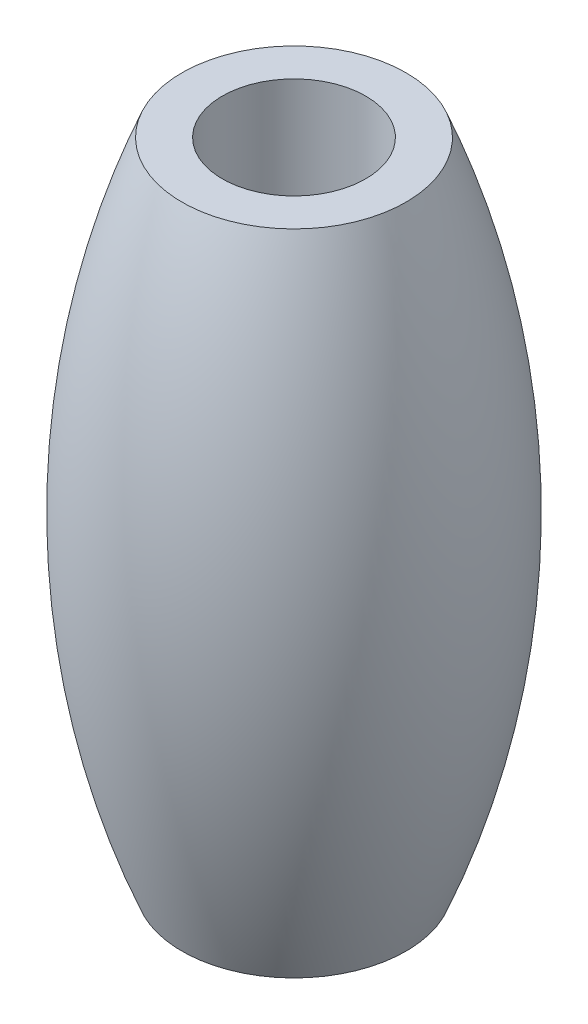
ISO-10303-21;
HEADER;
FILE_DESCRIPTION(('STEP AP214'),'2;1');
FILE_NAME('part.step','',(''),(''),'','','');
FILE_SCHEMA(('AUTOMOTIVE_DESIGN { 1 0 10303 214 1 1 1 1 }'));
ENDSEC;
DATA;
#1=APPLICATION_CONTEXT('core data for automotive mechanical design processes');
#2=APPLICATION_PROTOCOL_DEFINITION('international standard','automotive_design',2000,#1);
#3=PRODUCT_CONTEXT('',#1,'mechanical');
#4=PRODUCT('Part','Part','',(#3));
#5=PRODUCT_RELATED_PRODUCT_CATEGORY('part','',(#4));
#6=PRODUCT_DEFINITION_FORMATION('','',#4);
#7=PRODUCT_DEFINITION_CONTEXT('part definition',#1,'design');
#8=PRODUCT_DEFINITION('design','',#6,#7);
#9=PRODUCT_DEFINITION_SHAPE('','',#8);
#10=(LENGTH_UNIT() NAMED_UNIT(*) SI_UNIT(.MILLI.,.METRE.));
#11=(NAMED_UNIT(*) PLANE_ANGLE_UNIT() SI_UNIT($,.RADIAN.));
#12=(NAMED_UNIT(*) SI_UNIT($,.STERADIAN.) SOLID_ANGLE_UNIT());
#13=UNCERTAINTY_MEASURE_WITH_UNIT(LENGTH_MEASURE(1.E-05),#10,'distance_accuracy_value','');
#14=(GEOMETRIC_REPRESENTATION_CONTEXT(3) GLOBAL_UNCERTAINTY_ASSIGNED_CONTEXT((#13)) GLOBAL_UNIT_ASSIGNED_CONTEXT((#10,
#11,#12)) REPRESENTATION_CONTEXT('',''));
#15=CARTESIAN_POINT('',(0.,0.,0.));
#16=DIRECTION('',(0.,0.,1.));
#17=DIRECTION('',(1.,0.,0.));
#18=AXIS2_PLACEMENT_3D('',#15,#16,#17);
#19=CARTESIAN_POINT('',(7.62,0.,0.));
#20=DIRECTION('',(0.,-1.,0.));
#21=DIRECTION('',(0.,0.,-1.));
#22=AXIS2_PLACEMENT_3D('',#19,#20,#21);
#23=PLANE('',#22);
#24=CARTESIAN_POINT('',(0.,0.,0.));
#25=DIRECTION('',(0.,-1.,0.));
#26=DIRECTION('',(0.,0.,-1.));
#27=AXIS2_PLACEMENT_3D('',#24,#25,#26);
#28=CIRCLE('',#27,11.9032840938214);
#29=CARTESIAN_POINT('',(0.,0.,-11.9032840938214));
#30=VERTEX_POINT('',#29);
#31=EDGE_CURVE('E54',#30,#30,#28,.T.);
#32=ORIENTED_EDGE('',*,*,#31,.T.);
#33=EDGE_LOOP('',(#32));
#34=FACE_BOUND('',#33,.T.);
#35=CARTESIAN_POINT('',(0.,0.,0.));
#36=DIRECTION('',(0.,-1.,0.));
#37=DIRECTION('',(0.,0.,-1.));
#38=AXIS2_PLACEMENT_3D('',#35,#36,#37);
#39=CIRCLE('',#38,7.62);
#40=CARTESIAN_POINT('',(0.,0.,-7.62));
#41=VERTEX_POINT('',#40);
#42=EDGE_CURVE('E10',#41,#41,#39,.T.);
#43=ORIENTED_EDGE('',*,*,#42,.F.);
#44=EDGE_LOOP('',(#43));
#45=FACE_BOUND('',#44,.T.);
#46=ADVANCED_FACE('F37',(#34,#45),#23,.T.);
#47=CARTESIAN_POINT('',(0.,0.,0.));
#48=DIRECTION('',(0.,-1.,0.));
#49=DIRECTION('',(0.,0.,-1.));
#50=AXIS2_PLACEMENT_3D('',#47,#48,#49);
#51=CYLINDRICAL_SURFACE('',#50,7.62);
#52=ORIENTED_EDGE('',*,*,#42,.T.);
#53=EDGE_LOOP('',(#52));
#54=FACE_BOUND('',#53,.T.);
#55=CARTESIAN_POINT('',(0.,68.8962083350383,0.));
#56=DIRECTION('',(0.,-1.,0.));
#57=DIRECTION('',(0.,0.,-1.));
#58=AXIS2_PLACEMENT_3D('',#55,#56,#57);
#59=CIRCLE('',#58,7.62);
#60=CARTESIAN_POINT('',(0.,68.8962083350383,-7.62));
#61=VERTEX_POINT('',#60);
#62=EDGE_CURVE('E44',#61,#61,#59,.T.);
#63=ORIENTED_EDGE('',*,*,#62,.F.);
#64=EDGE_LOOP('',(#63));
#65=FACE_BOUND('',#64,.T.);
#66=ADVANCED_FACE('F71',(#54,#65),#51,.F.);
#67=CARTESIAN_POINT('',(7.62,68.8962083350383,0.));
#68=DIRECTION('',(0.,1.,0.));
#69=DIRECTION('',(0.,0.,1.));
#70=AXIS2_PLACEMENT_3D('',#67,#68,#69);
#71=PLANE('',#70);
#72=ORIENTED_EDGE('',*,*,#62,.T.);
#73=EDGE_LOOP('',(#72));
#74=FACE_BOUND('',#73,.T.);
#75=CARTESIAN_POINT('',(0.,68.8962083350383,0.));
#76=DIRECTION('',(0.,-1.,0.));
#77=DIRECTION('',(0.,0.,-1.));
#78=AXIS2_PLACEMENT_3D('',#75,#76,#77);
#79=CIRCLE('',#78,11.9032840938214);
#80=CARTESIAN_POINT('',(0.,68.8962083350383,-11.9032840938214));
#81=VERTEX_POINT('',#80);
#82=EDGE_CURVE('E49',#81,#81,#79,.T.);
#83=ORIENTED_EDGE('',*,*,#82,.F.);
#84=EDGE_LOOP('',(#83));
#85=FACE_BOUND('',#84,.T.);
#86=ADVANCED_FACE('F65',(#74,#85),#71,.T.);
#87=CARTESIAN_POINT('',(0.,34.4481041675192,0.));
#88=DIRECTION('',(0.,-1.,0.));
#89=DIRECTION('',(0.,0.,-1.));
#90=AXIS2_PLACEMENT_3D('',#87,#88,#89);
#91=DEGENERATE_TOROIDAL_SURFACE('',#90,73.7700930307118,92.3395875486714,.F.);
#92=ORIENTED_EDGE('',*,*,#82,.T.);
#93=EDGE_LOOP('',(#92));
#94=FACE_BOUND('',#93,.T.);
#95=ORIENTED_EDGE('',*,*,#31,.F.);
#96=EDGE_LOOP('',(#95));
#97=FACE_BOUND('',#96,.T.);
#98=ADVANCED_FACE('F63',(#94,#97),#91,.F.);
#99=CLOSED_SHELL('',(#46,#66,#86,#98));
#100=MANIFOLD_SOLID_BREP('B2',#99);
#101=ADVANCED_BREP_SHAPE_REPRESENTATION('',(#18,#100),#14);
#102=SHAPE_DEFINITION_REPRESENTATION(#9,#101);
ENDSEC;
END-ISO-10303-21;
